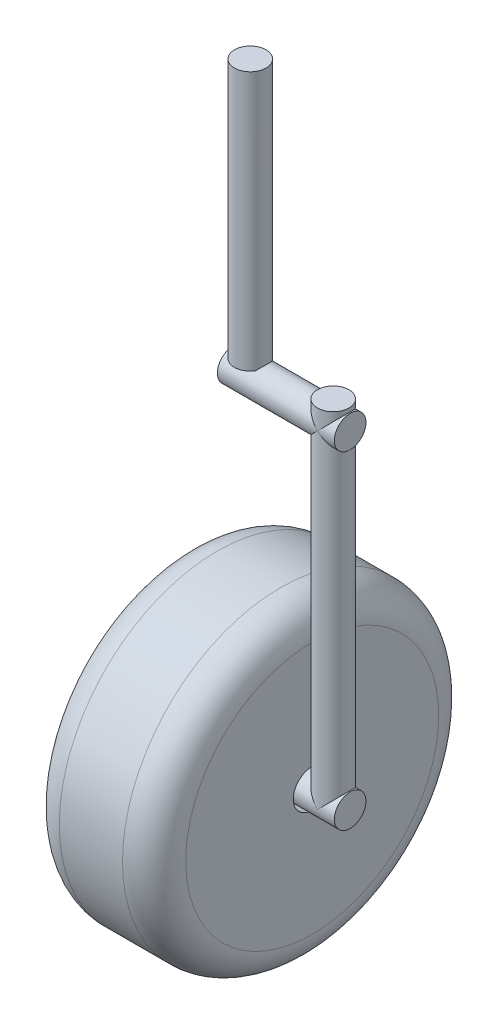
ISO-10303-21;
HEADER;
FILE_DESCRIPTION(('STEP AP214'),'2;1');
FILE_NAME('part.step','',(''),(''),'','','');
FILE_SCHEMA(('AUTOMOTIVE_DESIGN { 1 0 10303 214 1 1 1 1 }'));
ENDSEC;
DATA;
#1=APPLICATION_CONTEXT('core data for automotive mechanical design processes');
#2=APPLICATION_PROTOCOL_DEFINITION('international standard','automotive_design',2000,#1);
#3=PRODUCT_CONTEXT('',#1,'mechanical');
#4=PRODUCT('Part','Part','',(#3));
#5=PRODUCT_RELATED_PRODUCT_CATEGORY('part','',(#4));
#6=PRODUCT_DEFINITION_FORMATION('','',#4);
#7=PRODUCT_DEFINITION_CONTEXT('part definition',#1,'design');
#8=PRODUCT_DEFINITION('design','',#6,#7);
#9=PRODUCT_DEFINITION_SHAPE('','',#8);
#10=(LENGTH_UNIT() NAMED_UNIT(*) SI_UNIT(.MILLI.,.METRE.));
#11=(NAMED_UNIT(*) PLANE_ANGLE_UNIT() SI_UNIT($,.RADIAN.));
#12=(NAMED_UNIT(*) SI_UNIT($,.STERADIAN.) SOLID_ANGLE_UNIT());
#13=UNCERTAINTY_MEASURE_WITH_UNIT(LENGTH_MEASURE(1.E-05),#10,'distance_accuracy_value','');
#14=(GEOMETRIC_REPRESENTATION_CONTEXT(3) GLOBAL_UNCERTAINTY_ASSIGNED_CONTEXT((#13)) GLOBAL_UNIT_ASSIGNED_CONTEXT((#10,
#11,#12)) REPRESENTATION_CONTEXT('',''));
#15=CARTESIAN_POINT('',(0.,0.,0.));
#16=DIRECTION('',(0.,0.,1.));
#17=DIRECTION('',(1.,0.,0.));
#18=AXIS2_PLACEMENT_3D('',#15,#16,#17);
#19=CARTESIAN_POINT('',(5.2,10.3728576603756,0.));
#20=DIRECTION('',(-1.,0.,0.));
#21=DIRECTION('',(0.,0.,1.));
#22=AXIS2_PLACEMENT_3D('',#19,#20,#21);
#23=CYLINDRICAL_SURFACE('',#22,0.5);
#24=CARTESIAN_POINT('',(1.5,10.3728576603756,0.));
#25=DIRECTION('',(1.,0.,0.));
#26=DIRECTION('',(0.,0.,-1.));
#27=AXIS2_PLACEMENT_3D('',#24,#25,#26);
#28=CIRCLE('',#27,0.5);
#29=CARTESIAN_POINT('',(1.5,10.3728576603756,-0.5));
#30=VERTEX_POINT('',#29);
#31=EDGE_CURVE('E46',#30,#30,#28,.T.);
#32=ORIENTED_EDGE('',*,*,#31,.T.);
#33=EDGE_LOOP('',(#32));
#34=FACE_BOUND('',#33,.T.);
#35=CARTESIAN_POINT('',(4.6643499382345,10.3728576603756,0.));
#36=DIRECTION('',(0.707106781186547,-0.707106781186547,0.));
#37=DIRECTION('',(-0.707106781186547,-0.707106781186547,0.));
#38=AXIS2_PLACEMENT_3D('',#35,#36,#37);
#39=ELLIPSE('',#38,0.707106781186547,0.5);
#40=CARTESIAN_POINT('',(4.6643499382345,10.3728576603756,-0.5));
#41=VERTEX_POINT('',#40);
#42=CARTESIAN_POINT('',(4.6643499382345,10.3728576603756,0.5));
#43=VERTEX_POINT('',#42);
#44=EDGE_CURVE('E115',#41,#43,#39,.F.);
#45=ORIENTED_EDGE('',*,*,#44,.T.);
#46=CARTESIAN_POINT('',(4.6643499382345,10.3728576603756,0.));
#47=DIRECTION('',(-0.707106781186547,-0.707106781186547,0.));
#48=DIRECTION('',(0.707106781186547,-0.707106781186547,0.));
#49=AXIS2_PLACEMENT_3D('',#46,#47,#48);
#50=ELLIPSE('',#49,0.707106781186547,0.5);
#51=EDGE_CURVE('E120',#43,#41,#50,.T.);
#52=ORIENTED_EDGE('',*,*,#51,.T.);
#53=EDGE_LOOP('',(#45,#52));
#54=FACE_BOUND('',#53,.T.);
#55=DIRECTION('',(-1.,0.,0.));
#56=VECTOR('',#55,1.);
#57=CARTESIAN_POINT('',(5.2,10.8,-0.259902715838414));
#58=LINE('',#57,#56);
#59=CARTESIAN_POINT('',(2.46747178148337,10.8,-0.259902715838413));
#60=VERTEX_POINT('',#59);
#61=CARTESIAN_POINT('',(1.61318710223454,10.8,-0.259902715838413));
#62=VERTEX_POINT('',#61);
#63=EDGE_CURVE('E12',#60,#62,#58,.T.);
#64=ORIENTED_EDGE('',*,*,#63,.F.);
#65=CARTESIAN_POINT('',(2.04032944185895,10.3728576603756,0.));
#66=DIRECTION('',(-0.707106781186547,0.707106781186547,0.));
#67=DIRECTION('',(-0.707106781186547,-0.707106781186547,0.));
#68=AXIS2_PLACEMENT_3D('',#65,#66,#67);
#69=ELLIPSE('',#68,0.707106781186547,0.5);
#70=CARTESIAN_POINT('',(2.46747178148336,10.8,0.259902715838414));
#71=VERTEX_POINT('',#70);
#72=EDGE_CURVE('E51',#60,#71,#69,.F.);
#73=ORIENTED_EDGE('',*,*,#72,.T.);
#74=DIRECTION('',(-1.,0.,0.));
#75=VECTOR('',#74,1.);
#76=CARTESIAN_POINT('',(5.2,10.8,0.259902715838414));
#77=LINE('',#76,#75);
#78=CARTESIAN_POINT('',(1.61318710223454,10.8,0.259902715838414));
#79=VERTEX_POINT('',#78);
#80=EDGE_CURVE('E78',#79,#71,#77,.F.);
#81=ORIENTED_EDGE('',*,*,#80,.F.);
#82=CARTESIAN_POINT('',(2.04032944185895,10.3728576603756,0.));
#83=DIRECTION('',(-0.707106781186547,-0.707106781186547,0.));
#84=DIRECTION('',(-0.707106781186547,0.707106781186547,0.));
#85=AXIS2_PLACEMENT_3D('',#82,#83,#84);
#86=ELLIPSE('',#85,0.707106781186547,0.5);
#87=EDGE_CURVE('E61',#79,#62,#86,.T.);
#88=ORIENTED_EDGE('',*,*,#87,.T.);
#89=EDGE_LOOP('',(#64,#73,#81,#88));
#90=FACE_BOUND('',#89,.T.);
#91=ADVANCED_FACE('F42',(#34,#54,#90),#23,.T.);
#92=CARTESIAN_POINT('',(4.6643499382345,11.,0.));
#93=DIRECTION('',(0.,-1.,0.));
#94=DIRECTION('',(0.,0.,-1.));
#95=AXIS2_PLACEMENT_3D('',#92,#93,#94);
#96=CYLINDRICAL_SURFACE('',#95,0.5);
#97=CARTESIAN_POINT('',(4.6643499382345,0.,0.));
#98=DIRECTION('',(0.707106781186547,-0.707106781186547,0.));
#99=DIRECTION('',(0.707106781186547,0.707106781186547,0.));
#100=AXIS2_PLACEMENT_3D('',#97,#98,#99);
#101=ELLIPSE('',#100,0.707106781186547,0.5);
#102=CARTESIAN_POINT('',(4.6643499382345,0.,-0.5));
#103=VERTEX_POINT('',#102);
#104=CARTESIAN_POINT('',(4.6643499382345,0.,0.5));
#105=VERTEX_POINT('',#104);
#106=EDGE_CURVE('E112',#103,#105,#101,.T.);
#107=ORIENTED_EDGE('',*,*,#106,.F.);
#108=CARTESIAN_POINT('',(4.6643499382345,0.,0.));
#109=DIRECTION('',(0.707106781186547,0.707106781186547,0.));
#110=DIRECTION('',(0.707106781186547,-0.707106781186547,0.));
#111=AXIS2_PLACEMENT_3D('',#108,#109,#110);
#112=ELLIPSE('',#111,0.707106781186547,0.5);
#113=EDGE_CURVE('E109',#105,#103,#112,.F.);
#114=ORIENTED_EDGE('',*,*,#113,.F.);
#115=EDGE_LOOP('',(#107,#114));
#116=FACE_BOUND('',#115,.T.);
#117=CARTESIAN_POINT('',(4.6643499382345,10.3728576603756,0.));
#118=DIRECTION('',(-0.707106781186547,-0.707106781186547,0.));
#119=DIRECTION('',(0.707106781186547,-0.707106781186547,0.));
#120=AXIS2_PLACEMENT_3D('',#117,#118,#119);
#121=ELLIPSE('',#120,0.707106781186547,0.5);
#122=EDGE_CURVE('E88',#43,#41,#121,.F.);
#123=ORIENTED_EDGE('',*,*,#122,.F.);
#124=ORIENTED_EDGE('',*,*,#44,.F.);
#125=EDGE_LOOP('',(#123,#124));
#126=FACE_BOUND('',#125,.T.);
#127=ADVANCED_FACE('F131',(#116,#126),#96,.T.);
#128=CARTESIAN_POINT('',(-0.5,0.,0.));
#129=DIRECTION('',(1.,0.,0.));
#130=DIRECTION('',(0.,0.,-1.));
#131=AXIS2_PLACEMENT_3D('',#128,#129,#130);
#132=CYLINDRICAL_SURFACE('',#131,0.5);
#133=CARTESIAN_POINT('',(-0.5,0.,0.));
#134=DIRECTION('',(1.,0.,0.));
#135=DIRECTION('',(0.,0.,-1.));
#136=AXIS2_PLACEMENT_3D('',#133,#134,#135);
#137=CIRCLE('',#136,0.5);
#138=CARTESIAN_POINT('',(-0.5,0.,-0.5));
#139=VERTEX_POINT('',#138);
#140=EDGE_CURVE('E106',#139,#139,#137,.T.);
#141=ORIENTED_EDGE('',*,*,#140,.T.);
#142=EDGE_LOOP('',(#141));
#143=FACE_BOUND('',#142,.T.);
#144=CARTESIAN_POINT('',(5.2,0.,0.));
#145=DIRECTION('',(1.,0.,0.));
#146=DIRECTION('',(0.,0.,-1.));
#147=AXIS2_PLACEMENT_3D('',#144,#145,#146);
#148=CIRCLE('',#147,0.5);
#149=CARTESIAN_POINT('',(5.2,0.,-0.5));
#150=VERTEX_POINT('',#149);
#151=EDGE_CURVE('E103',#150,#150,#148,.T.);
#152=ORIENTED_EDGE('',*,*,#151,.F.);
#153=EDGE_LOOP('',(#152));
#154=FACE_BOUND('',#153,.T.);
#155=ORIENTED_EDGE('',*,*,#113,.T.);
#156=ORIENTED_EDGE('',*,*,#106,.T.);
#157=EDGE_LOOP('',(#155,#156));
#158=FACE_BOUND('',#157,.T.);
#159=ADVANCED_FACE('F44',(#143,#154,#158),#132,.T.);
#160=CARTESIAN_POINT('',(-0.5,0.,0.));
#161=DIRECTION('',(1.,0.,0.));
#162=DIRECTION('',(0.,0.,-1.));
#163=AXIS2_PLACEMENT_3D('',#160,#161,#162);
#164=PLANE('',#163);
#165=ORIENTED_EDGE('',*,*,#140,.F.);
#166=EDGE_LOOP('',(#165));
#167=FACE_BOUND('',#166,.T.);
#168=ADVANCED_FACE('F156',(#167),#164,.F.);
#169=CARTESIAN_POINT('',(5.2,0.,0.));
#170=DIRECTION('',(1.,0.,0.));
#171=DIRECTION('',(0.,0.,-1.));
#172=AXIS2_PLACEMENT_3D('',#169,#170,#171);
#173=PLANE('',#172);
#174=ORIENTED_EDGE('',*,*,#151,.T.);
#175=EDGE_LOOP('',(#174));
#176=FACE_BOUND('',#175,.T.);
#177=ADVANCED_FACE('F148',(#176),#173,.T.);
#178=CARTESIAN_POINT('',(5.2,10.3728576603756,0.));
#179=DIRECTION('',(1.,0.,0.));
#180=DIRECTION('',(0.,0.,-1.));
#181=AXIS2_PLACEMENT_3D('',#178,#179,#180);
#182=CIRCLE('',#181,0.5);
#183=CARTESIAN_POINT('',(5.2,10.3728576603756,-0.5));
#184=VERTEX_POINT('',#183);
#185=EDGE_CURVE('E94',#184,#184,#182,.T.);
#186=ORIENTED_EDGE('',*,*,#185,.F.);
#187=EDGE_LOOP('',(#186));
#188=FACE_BOUND('',#187,.T.);
#189=CARTESIAN_POINT('',(4.6643499382345,10.3728576603756,0.));
#190=DIRECTION('',(0.707106781186547,-0.707106781186547,0.));
#191=DIRECTION('',(-0.707106781186547,-0.707106781186547,0.));
#192=AXIS2_PLACEMENT_3D('',#189,#190,#191);
#193=ELLIPSE('',#192,0.707106781186547,0.5);
#194=EDGE_CURVE('E117',#41,#43,#193,.T.);
#195=ORIENTED_EDGE('',*,*,#194,.T.);
#196=ORIENTED_EDGE('',*,*,#122,.T.);
#197=EDGE_LOOP('',(#195,#196));
#198=FACE_BOUND('',#197,.T.);
#199=ADVANCED_FACE('F127',(#188,#198),#23,.T.);
#200=CARTESIAN_POINT('',(5.2,10.3728576603756,0.));
#201=DIRECTION('',(1.,0.,0.));
#202=DIRECTION('',(0.,0.,-1.));
#203=AXIS2_PLACEMENT_3D('',#200,#201,#202);
#204=PLANE('',#203);
#205=ORIENTED_EDGE('',*,*,#185,.T.);
#206=EDGE_LOOP('',(#205));
#207=FACE_BOUND('',#206,.T.);
#208=ADVANCED_FACE('F147',(#207),#204,.T.);
#209=CARTESIAN_POINT('',(4.6643499382345,11.,0.));
#210=DIRECTION('',(0.,1.,0.));
#211=DIRECTION('',(0.,0.,1.));
#212=AXIS2_PLACEMENT_3D('',#209,#210,#211);
#213=PLANE('',#212);
#214=CARTESIAN_POINT('',(4.6643499382345,11.,0.));
#215=DIRECTION('',(0.,1.,0.));
#216=DIRECTION('',(0.,0.,1.));
#217=AXIS2_PLACEMENT_3D('',#214,#215,#216);
#218=CIRCLE('',#217,0.5);
#219=CARTESIAN_POINT('',(4.6643499382345,11.,0.5));
#220=VERTEX_POINT('',#219);
#221=EDGE_CURVE('E100',#220,#220,#218,.T.);
#222=ORIENTED_EDGE('',*,*,#221,.T.);
#223=EDGE_LOOP('',(#222));
#224=FACE_BOUND('',#223,.T.);
#225=ADVANCED_FACE('F154',(#224),#213,.T.);
#226=ORIENTED_EDGE('',*,*,#221,.F.);
#227=EDGE_LOOP('',(#226));
#228=FACE_BOUND('',#227,.T.);
#229=ORIENTED_EDGE('',*,*,#51,.F.);
#230=ORIENTED_EDGE('',*,*,#194,.F.);
#231=EDGE_LOOP('',(#229,#230));
#232=FACE_BOUND('',#231,.T.);
#233=ADVANCED_FACE('F133',(#228,#232),#96,.T.);
#234=CARTESIAN_POINT('',(2.04032944185895,10.8,0.));
#235=DIRECTION('',(0.,1.,0.));
#236=DIRECTION('',(0.,0.,1.));
#237=AXIS2_PLACEMENT_3D('',#234,#235,#236);
#238=CYLINDRICAL_SURFACE('',#237,0.5);
#239=CARTESIAN_POINT('',(2.04032944185895,19.,0.));
#240=DIRECTION('',(0.,1.,0.));
#241=DIRECTION('',(0.,0.,1.));
#242=AXIS2_PLACEMENT_3D('',#239,#240,#241);
#243=CIRCLE('',#242,0.5);
#244=CARTESIAN_POINT('',(2.04032944185895,19.,0.5));
#245=VERTEX_POINT('',#244);
#246=EDGE_CURVE('E92',#245,#245,#243,.T.);
#247=ORIENTED_EDGE('',*,*,#246,.F.);
#248=EDGE_LOOP('',(#247));
#249=FACE_BOUND('',#248,.T.);
#250=ORIENTED_EDGE('',*,*,#72,.F.);
#251=CARTESIAN_POINT('',(2.04032944185895,10.8,0.));
#252=DIRECTION('',(0.,1.,0.));
#253=DIRECTION('',(0.,0.,1.));
#254=AXIS2_PLACEMENT_3D('',#251,#252,#253);
#255=CIRCLE('',#254,0.5);
#256=EDGE_CURVE('E91',#60,#62,#255,.T.);
#257=ORIENTED_EDGE('',*,*,#256,.T.);
#258=ORIENTED_EDGE('',*,*,#87,.F.);
#259=EDGE_CURVE('E87',#79,#71,#255,.T.);
#260=ORIENTED_EDGE('',*,*,#259,.T.);
#261=EDGE_LOOP('',(#250,#257,#258,#260));
#262=FACE_BOUND('',#261,.T.);
#263=ADVANCED_FACE('F90',(#249,#262),#238,.T.);
#264=CARTESIAN_POINT('',(2.04032944185895,10.8,0.));
#265=DIRECTION('',(0.,1.,0.));
#266=DIRECTION('',(0.,0.,1.));
#267=AXIS2_PLACEMENT_3D('',#264,#265,#266);
#268=PLANE('',#267);
#269=ORIENTED_EDGE('',*,*,#256,.F.);
#270=ORIENTED_EDGE('',*,*,#63,.T.);
#271=EDGE_LOOP('',(#269,#270));
#272=FACE_BOUND('',#271,.T.);
#273=ADVANCED_FACE('F174',(#272),#268,.F.);
#274=ORIENTED_EDGE('',*,*,#259,.F.);
#275=ORIENTED_EDGE('',*,*,#80,.T.);
#276=EDGE_LOOP('',(#274,#275));
#277=FACE_BOUND('',#276,.T.);
#278=ADVANCED_FACE('F86',(#277),#268,.F.);
#279=CARTESIAN_POINT('',(2.04032944185895,19.,0.));
#280=DIRECTION('',(0.,1.,0.));
#281=DIRECTION('',(0.,0.,1.));
#282=AXIS2_PLACEMENT_3D('',#279,#280,#281);
#283=PLANE('',#282);
#284=ORIENTED_EDGE('',*,*,#246,.T.);
#285=EDGE_LOOP('',(#284));
#286=FACE_BOUND('',#285,.T.);
#287=ADVANCED_FACE('F184',(#286),#283,.T.);
#288=CARTESIAN_POINT('',(1.5,0.,0.));
#289=DIRECTION('',(1.,0.,0.));
#290=DIRECTION('',(0.,0.,-1.));
#291=AXIS2_PLACEMENT_3D('',#288,#289,#290);
#292=PLANE('',#291);
#293=ORIENTED_EDGE('',*,*,#31,.F.);
#294=EDGE_LOOP('',(#293));
#295=FACE_BOUND('',#294,.T.);
#296=ADVANCED_FACE('F187',(#295),#292,.F.);
#297=CLOSED_SHELL('',(#91,#127,#159,#168,#177,#199,#208,#225,#233,#263,#273,#278,#287,#296));
#298=MANIFOLD_SOLID_BREP('B2',#297);
#299=CARTESIAN_POINT('',(4.,0.,0.));
#300=DIRECTION('',(1.,0.,0.));
#301=DIRECTION('',(0.,0.,-1.));
#302=AXIS2_PLACEMENT_3D('',#299,#300,#301);
#303=PLANE('',#302);
#304=CARTESIAN_POINT('',(4.,0.,0.));
#305=DIRECTION('',(1.,0.,0.));
#306=DIRECTION('',(0.,0.,-1.));
#307=AXIS2_PLACEMENT_3D('',#304,#305,#306);
#308=CIRCLE('',#307,4.);
#309=CARTESIAN_POINT('',(4.,0.,-4.));
#310=VERTEX_POINT('',#309);
#311=EDGE_CURVE('E280',#310,#310,#308,.T.);
#312=ORIENTED_EDGE('',*,*,#311,.T.);
#313=EDGE_LOOP('',(#312));
#314=FACE_BOUND('',#313,.T.);
#315=CARTESIAN_POINT('',(4.,0.,0.));
#316=DIRECTION('',(1.,0.,0.));
#317=DIRECTION('',(0.,0.,-1.));
#318=AXIS2_PLACEMENT_3D('',#315,#316,#317);
#319=CIRCLE('',#318,0.6);
#320=CARTESIAN_POINT('',(4.,0.,-0.6));
#321=VERTEX_POINT('',#320);
#322=EDGE_CURVE('E293',#321,#321,#319,.T.);
#323=ORIENTED_EDGE('',*,*,#322,.F.);
#324=EDGE_LOOP('',(#323));
#325=FACE_BOUND('',#324,.T.);
#326=ADVANCED_FACE('F273',(#314,#325),#303,.T.);
#327=CARTESIAN_POINT('',(0.,0.,0.));
#328=DIRECTION('',(1.,0.,0.));
#329=DIRECTION('',(0.,0.,-1.));
#330=AXIS2_PLACEMENT_3D('',#327,#328,#329);
#331=PLANE('',#330);
#332=CARTESIAN_POINT('',(0.,0.,0.));
#333=DIRECTION('',(1.,0.,0.));
#334=DIRECTION('',(0.,0.,-1.));
#335=AXIS2_PLACEMENT_3D('',#332,#333,#334);
#336=CIRCLE('',#335,4.);
#337=CARTESIAN_POINT('',(0.,0.,-4.));
#338=VERTEX_POINT('',#337);
#339=EDGE_CURVE('E284',#338,#338,#336,.F.);
#340=ORIENTED_EDGE('',*,*,#339,.T.);
#341=EDGE_LOOP('',(#340));
#342=FACE_BOUND('',#341,.T.);
#343=CARTESIAN_POINT('',(0.,0.,0.));
#344=DIRECTION('',(1.,0.,0.));
#345=DIRECTION('',(0.,0.,-1.));
#346=AXIS2_PLACEMENT_3D('',#343,#344,#345);
#347=CIRCLE('',#346,0.6);
#348=CARTESIAN_POINT('',(0.,0.,-0.6));
#349=VERTEX_POINT('',#348);
#350=EDGE_CURVE('E294',#349,#349,#347,.T.);
#351=ORIENTED_EDGE('',*,*,#350,.T.);
#352=EDGE_LOOP('',(#351));
#353=FACE_BOUND('',#352,.T.);
#354=ADVANCED_FACE('F304',(#342,#353),#331,.F.);
#355=CARTESIAN_POINT('',(4.,0.,0.));
#356=DIRECTION('',(-1.,0.,0.));
#357=DIRECTION('',(0.,0.,1.));
#358=AXIS2_PLACEMENT_3D('',#355,#356,#357);
#359=CYLINDRICAL_SURFACE('',#358,5.);
#360=CARTESIAN_POINT('',(3.,0.,0.));
#361=DIRECTION('',(1.,0.,0.));
#362=DIRECTION('',(0.,0.,-1.));
#363=AXIS2_PLACEMENT_3D('',#360,#361,#362);
#364=CIRCLE('',#363,5.);
#365=CARTESIAN_POINT('',(3.,0.,-5.));
#366=VERTEX_POINT('',#365);
#367=EDGE_CURVE('E41',#366,#366,#364,.F.);
#368=ORIENTED_EDGE('',*,*,#367,.T.);
#369=EDGE_LOOP('',(#368));
#370=FACE_BOUND('',#369,.T.);
#371=CARTESIAN_POINT('',(1.,0.,0.));
#372=DIRECTION('',(1.,0.,0.));
#373=DIRECTION('',(0.,0.,-1.));
#374=AXIS2_PLACEMENT_3D('',#371,#372,#373);
#375=CIRCLE('',#374,5.);
#376=CARTESIAN_POINT('',(1.,0.,-5.));
#377=VERTEX_POINT('',#376);
#378=EDGE_CURVE('E288',#377,#377,#375,.T.);
#379=ORIENTED_EDGE('',*,*,#378,.T.);
#380=EDGE_LOOP('',(#379));
#381=FACE_BOUND('',#380,.T.);
#382=ADVANCED_FACE('F309',(#370,#381),#359,.T.);
#383=CARTESIAN_POINT('',(4.,0.,0.));
#384=DIRECTION('',(-1.,0.,0.));
#385=DIRECTION('',(0.,0.,1.));
#386=AXIS2_PLACEMENT_3D('',#383,#384,#385);
#387=CYLINDRICAL_SURFACE('',#386,0.6);
#388=ORIENTED_EDGE('',*,*,#322,.T.);
#389=EDGE_LOOP('',(#388));
#390=FACE_BOUND('',#389,.T.);
#391=ORIENTED_EDGE('',*,*,#350,.F.);
#392=EDGE_LOOP('',(#391));
#393=FACE_BOUND('',#392,.T.);
#394=ADVANCED_FACE('F300',(#390,#393),#387,.F.);
#395=CARTESIAN_POINT('',(1.,0.,0.));
#396=DIRECTION('',(1.,0.,0.));
#397=DIRECTION('',(0.,0.,-1.));
#398=AXIS2_PLACEMENT_3D('',#395,#396,#397);
#399=TOROIDAL_SURFACE('',#398,4.,1.);
#400=ORIENTED_EDGE('',*,*,#339,.F.);
#401=EDGE_LOOP('',(#400));
#402=FACE_BOUND('',#401,.T.);
#403=ORIENTED_EDGE('',*,*,#378,.F.);
#404=EDGE_LOOP('',(#403));
#405=FACE_BOUND('',#404,.T.);
#406=ADVANCED_FACE('F315',(#402,#405),#399,.T.);
#407=CARTESIAN_POINT('',(3.,0.,0.));
#408=DIRECTION('',(1.,0.,0.));
#409=DIRECTION('',(0.,0.,-1.));
#410=AXIS2_PLACEMENT_3D('',#407,#408,#409);
#411=TOROIDAL_SURFACE('',#410,4.,1.);
#412=ORIENTED_EDGE('',*,*,#367,.F.);
#413=EDGE_LOOP('',(#412));
#414=FACE_BOUND('',#413,.T.);
#415=ORIENTED_EDGE('',*,*,#311,.F.);
#416=EDGE_LOOP('',(#415));
#417=FACE_BOUND('',#416,.T.);
#418=ADVANCED_FACE('F275',(#414,#417),#411,.T.);
#419=CLOSED_SHELL('',(#326,#354,#382,#394,#406,#418));
#420=MANIFOLD_SOLID_BREP('B6',#419);
#421=ADVANCED_BREP_SHAPE_REPRESENTATION('',(#18,#298,#420),#14);
#422=SHAPE_DEFINITION_REPRESENTATION(#9,#421);
ENDSEC;
END-ISO-10303-21;
